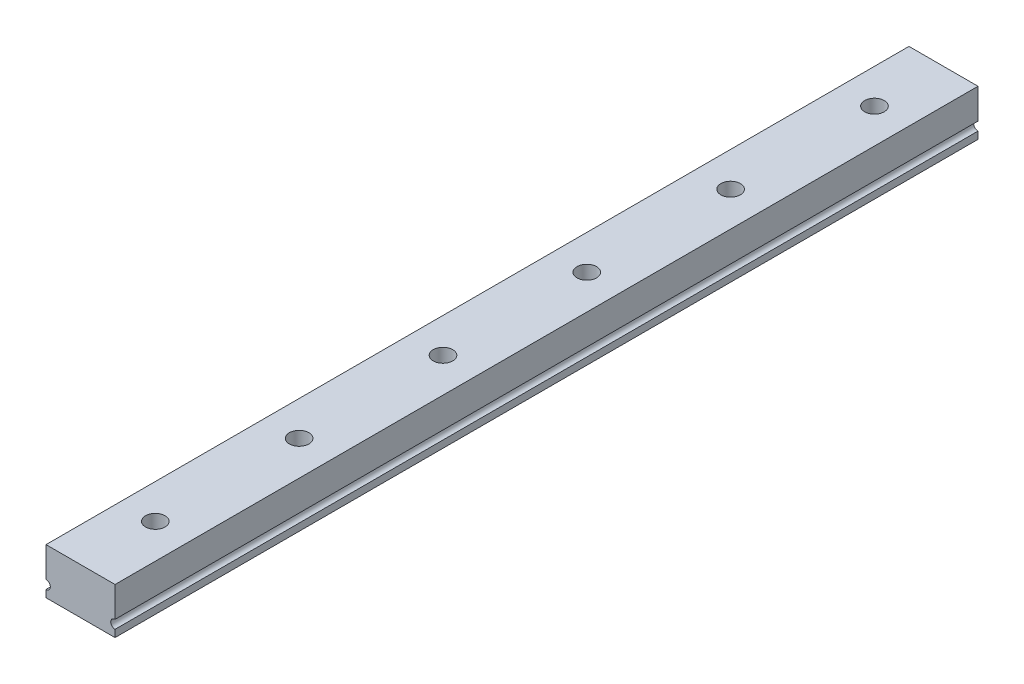
ISO-10303-21;
HEADER;
FILE_DESCRIPTION(('STEP AP214'),'2;1');
FILE_NAME('part.step','',(''),(''),'','','');
FILE_SCHEMA(('AUTOMOTIVE_DESIGN { 1 0 10303 214 1 1 1 1 }'));
ENDSEC;
DATA;
#1=APPLICATION_CONTEXT('core data for automotive mechanical design processes');
#2=APPLICATION_PROTOCOL_DEFINITION('international standard','automotive_design',2000,#1);
#3=PRODUCT_CONTEXT('',#1,'mechanical');
#4=PRODUCT('Part','Part','',(#3));
#5=PRODUCT_RELATED_PRODUCT_CATEGORY('part','',(#4));
#6=PRODUCT_DEFINITION_FORMATION('','',#4);
#7=PRODUCT_DEFINITION_CONTEXT('part definition',#1,'design');
#8=PRODUCT_DEFINITION('design','',#6,#7);
#9=PRODUCT_DEFINITION_SHAPE('','',#8);
#10=(LENGTH_UNIT() NAMED_UNIT(*) SI_UNIT(.MILLI.,.METRE.));
#11=(NAMED_UNIT(*) PLANE_ANGLE_UNIT() SI_UNIT($,.RADIAN.));
#12=(NAMED_UNIT(*) SI_UNIT($,.STERADIAN.) SOLID_ANGLE_UNIT());
#13=UNCERTAINTY_MEASURE_WITH_UNIT(LENGTH_MEASURE(1.E-05),#10,'distance_accuracy_value','');
#14=(GEOMETRIC_REPRESENTATION_CONTEXT(3) GLOBAL_UNCERTAINTY_ASSIGNED_CONTEXT((#13)) GLOBAL_UNIT_ASSIGNED_CONTEXT((#10,
#11,#12)) REPRESENTATION_CONTEXT('',''));
#15=CARTESIAN_POINT('',(0.,0.,0.));
#16=DIRECTION('',(0.,0.,1.));
#17=DIRECTION('',(1.,0.,0.));
#18=AXIS2_PLACEMENT_3D('',#15,#16,#17);
#19=CARTESIAN_POINT('',(0.,-28.,-188.));
#20=DIRECTION('',(0.,-1.,0.));
#21=DIRECTION('',(0.,0.,-1.));
#22=AXIS2_PLACEMENT_3D('',#19,#20,#21);
#23=CYLINDRICAL_SURFACE('',#22,4.6755);
#24=CARTESIAN_POINT('',(0.,-26.,-188.));
#25=DIRECTION('',(0.,-1.,0.));
#26=DIRECTION('',(0.,0.,-1.));
#27=AXIS2_PLACEMENT_3D('',#24,#25,#26);
#28=CIRCLE('',#27,4.6755);
#29=CARTESIAN_POINT('',(0.,-26.,-192.6755));
#30=VERTEX_POINT('',#29);
#31=EDGE_CURVE('E11',#30,#30,#28,.T.);
#32=ORIENTED_EDGE('',*,*,#31,.F.);
#33=EDGE_LOOP('',(#32));
#34=FACE_BOUND('',#33,.T.);
#35=CARTESIAN_POINT('',(0.,-28.,-188.));
#36=DIRECTION('',(0.,-1.,0.));
#37=DIRECTION('',(0.,0.,-1.));
#38=AXIS2_PLACEMENT_3D('',#35,#36,#37);
#39=CIRCLE('',#38,4.6755);
#40=CARTESIAN_POINT('',(0.,-28.,-192.6755));
#41=VERTEX_POINT('',#40);
#42=EDGE_CURVE('E173',#41,#41,#39,.T.);
#43=ORIENTED_EDGE('',*,*,#42,.T.);
#44=EDGE_LOOP('',(#43));
#45=FACE_BOUND('',#44,.T.);
#46=ADVANCED_FACE('F33',(#34,#45),#23,.F.);
#47=CARTESIAN_POINT('',(1.7,-26.,-188.));
#48=DIRECTION('',(0.,1.,0.));
#49=DIRECTION('',(0.,0.,1.));
#50=AXIS2_PLACEMENT_3D('',#47,#48,#49);
#51=PLANE('',#50);
#52=CARTESIAN_POINT('',(0.,-26.,-188.));
#53=DIRECTION('',(0.,-1.,0.));
#54=DIRECTION('',(0.,0.,-1.));
#55=AXIS2_PLACEMENT_3D('',#52,#53,#54);
#56=CIRCLE('',#55,1.7);
#57=CARTESIAN_POINT('',(0.,-26.,-189.7));
#58=VERTEX_POINT('',#57);
#59=EDGE_CURVE('E40',#58,#58,#56,.T.);
#60=ORIENTED_EDGE('',*,*,#59,.F.);
#61=EDGE_LOOP('',(#60));
#62=FACE_BOUND('',#61,.T.);
#63=ORIENTED_EDGE('',*,*,#31,.T.);
#64=EDGE_LOOP('',(#63));
#65=FACE_BOUND('',#64,.T.);
#66=ADVANCED_FACE('F184',(#62,#65),#51,.F.);
#67=CARTESIAN_POINT('',(0.,-28.,-188.));
#68=DIRECTION('',(0.,-1.,0.));
#69=DIRECTION('',(0.,0.,-1.));
#70=AXIS2_PLACEMENT_3D('',#67,#68,#69);
#71=CYLINDRICAL_SURFACE('',#70,1.7);
#72=ORIENTED_EDGE('',*,*,#59,.T.);
#73=EDGE_LOOP('',(#72));
#74=FACE_BOUND('',#73,.T.);
#75=CARTESIAN_POINT('',(0.,-20.,-188.));
#76=DIRECTION('',(0.,1.,0.));
#77=DIRECTION('',(0.,0.,1.));
#78=AXIS2_PLACEMENT_3D('',#75,#76,#77);
#79=CIRCLE('',#78,1.7);
#80=CARTESIAN_POINT('',(0.,-20.,-186.3));
#81=VERTEX_POINT('',#80);
#82=EDGE_CURVE('E176',#81,#81,#79,.T.);
#83=ORIENTED_EDGE('',*,*,#82,.T.);
#84=EDGE_LOOP('',(#83));
#85=FACE_BOUND('',#84,.T.);
#86=ADVANCED_FACE('F181',(#74,#85),#71,.F.);
#87=CARTESIAN_POINT('',(0.,-28.,-163.));
#88=DIRECTION('',(0.,-1.,0.));
#89=DIRECTION('',(0.,0.,-1.));
#90=AXIS2_PLACEMENT_3D('',#87,#88,#89);
#91=CYLINDRICAL_SURFACE('',#90,4.6755);
#92=CARTESIAN_POINT('',(0.,-26.,-163.));
#93=DIRECTION('',(0.,-1.,0.));
#94=DIRECTION('',(0.,0.,-1.));
#95=AXIS2_PLACEMENT_3D('',#92,#93,#94);
#96=CIRCLE('',#95,4.6755);
#97=CARTESIAN_POINT('',(0.,-26.,-167.6755));
#98=VERTEX_POINT('',#97);
#99=EDGE_CURVE('E170',#98,#98,#96,.T.);
#100=ORIENTED_EDGE('',*,*,#99,.F.);
#101=EDGE_LOOP('',(#100));
#102=FACE_BOUND('',#101,.T.);
#103=CARTESIAN_POINT('',(0.,-28.,-163.));
#104=DIRECTION('',(0.,-1.,0.));
#105=DIRECTION('',(0.,0.,-1.));
#106=AXIS2_PLACEMENT_3D('',#103,#104,#105);
#107=CIRCLE('',#106,4.6755);
#108=CARTESIAN_POINT('',(0.,-28.,-167.6755));
#109=VERTEX_POINT('',#108);
#110=EDGE_CURVE('E161',#109,#109,#107,.T.);
#111=ORIENTED_EDGE('',*,*,#110,.T.);
#112=EDGE_LOOP('',(#111));
#113=FACE_BOUND('',#112,.T.);
#114=ADVANCED_FACE('F248',(#102,#113),#91,.F.);
#115=CARTESIAN_POINT('',(1.7,-26.,-163.));
#116=DIRECTION('',(0.,1.,0.));
#117=DIRECTION('',(0.,0.,1.));
#118=AXIS2_PLACEMENT_3D('',#115,#116,#117);
#119=PLANE('',#118);
#120=CARTESIAN_POINT('',(0.,-26.,-163.));
#121=DIRECTION('',(0.,-1.,0.));
#122=DIRECTION('',(0.,0.,-1.));
#123=AXIS2_PLACEMENT_3D('',#120,#121,#122);
#124=CIRCLE('',#123,1.7);
#125=CARTESIAN_POINT('',(0.,-26.,-164.7));
#126=VERTEX_POINT('',#125);
#127=EDGE_CURVE('E167',#126,#126,#124,.T.);
#128=ORIENTED_EDGE('',*,*,#127,.F.);
#129=EDGE_LOOP('',(#128));
#130=FACE_BOUND('',#129,.T.);
#131=ORIENTED_EDGE('',*,*,#99,.T.);
#132=EDGE_LOOP('',(#131));
#133=FACE_BOUND('',#132,.T.);
#134=ADVANCED_FACE('F244',(#130,#133),#119,.F.);
#135=CARTESIAN_POINT('',(0.,-28.,-163.));
#136=DIRECTION('',(0.,-1.,0.));
#137=DIRECTION('',(0.,0.,-1.));
#138=AXIS2_PLACEMENT_3D('',#135,#136,#137);
#139=CYLINDRICAL_SURFACE('',#138,1.7);
#140=ORIENTED_EDGE('',*,*,#127,.T.);
#141=EDGE_LOOP('',(#140));
#142=FACE_BOUND('',#141,.T.);
#143=CARTESIAN_POINT('',(0.,-20.,-163.));
#144=DIRECTION('',(0.,1.,0.));
#145=DIRECTION('',(0.,0.,1.));
#146=AXIS2_PLACEMENT_3D('',#143,#144,#145);
#147=CIRCLE('',#146,1.7);
#148=CARTESIAN_POINT('',(0.,-20.,-161.3));
#149=VERTEX_POINT('',#148);
#150=EDGE_CURVE('E164',#149,#149,#147,.T.);
#151=ORIENTED_EDGE('',*,*,#150,.T.);
#152=EDGE_LOOP('',(#151));
#153=FACE_BOUND('',#152,.T.);
#154=ADVANCED_FACE('F240',(#142,#153),#139,.F.);
#155=CARTESIAN_POINT('',(0.,-28.,-138.));
#156=DIRECTION('',(0.,-1.,0.));
#157=DIRECTION('',(0.,0.,-1.));
#158=AXIS2_PLACEMENT_3D('',#155,#156,#157);
#159=CYLINDRICAL_SURFACE('',#158,4.6755);
#160=CARTESIAN_POINT('',(0.,-26.,-138.));
#161=DIRECTION('',(0.,-1.,0.));
#162=DIRECTION('',(0.,0.,-1.));
#163=AXIS2_PLACEMENT_3D('',#160,#161,#162);
#164=CIRCLE('',#163,4.6755);
#165=CARTESIAN_POINT('',(0.,-26.,-142.6755));
#166=VERTEX_POINT('',#165);
#167=EDGE_CURVE('E158',#166,#166,#164,.T.);
#168=ORIENTED_EDGE('',*,*,#167,.F.);
#169=EDGE_LOOP('',(#168));
#170=FACE_BOUND('',#169,.T.);
#171=CARTESIAN_POINT('',(0.,-28.,-138.));
#172=DIRECTION('',(0.,-1.,0.));
#173=DIRECTION('',(0.,0.,-1.));
#174=AXIS2_PLACEMENT_3D('',#171,#172,#173);
#175=CIRCLE('',#174,4.6755);
#176=CARTESIAN_POINT('',(0.,-28.,-142.6755));
#177=VERTEX_POINT('',#176);
#178=EDGE_CURVE('E149',#177,#177,#175,.T.);
#179=ORIENTED_EDGE('',*,*,#178,.T.);
#180=EDGE_LOOP('',(#179));
#181=FACE_BOUND('',#180,.T.);
#182=ADVANCED_FACE('F236',(#170,#181),#159,.F.);
#183=CARTESIAN_POINT('',(1.7,-26.,-138.));
#184=DIRECTION('',(0.,1.,0.));
#185=DIRECTION('',(0.,0.,1.));
#186=AXIS2_PLACEMENT_3D('',#183,#184,#185);
#187=PLANE('',#186);
#188=CARTESIAN_POINT('',(0.,-26.,-138.));
#189=DIRECTION('',(0.,-1.,0.));
#190=DIRECTION('',(0.,0.,-1.));
#191=AXIS2_PLACEMENT_3D('',#188,#189,#190);
#192=CIRCLE('',#191,1.7);
#193=CARTESIAN_POINT('',(0.,-26.,-139.7));
#194=VERTEX_POINT('',#193);
#195=EDGE_CURVE('E155',#194,#194,#192,.T.);
#196=ORIENTED_EDGE('',*,*,#195,.F.);
#197=EDGE_LOOP('',(#196));
#198=FACE_BOUND('',#197,.T.);
#199=ORIENTED_EDGE('',*,*,#167,.T.);
#200=EDGE_LOOP('',(#199));
#201=FACE_BOUND('',#200,.T.);
#202=ADVANCED_FACE('F232',(#198,#201),#187,.F.);
#203=CARTESIAN_POINT('',(0.,-28.,-138.));
#204=DIRECTION('',(0.,-1.,0.));
#205=DIRECTION('',(0.,0.,-1.));
#206=AXIS2_PLACEMENT_3D('',#203,#204,#205);
#207=CYLINDRICAL_SURFACE('',#206,1.7);
#208=ORIENTED_EDGE('',*,*,#195,.T.);
#209=EDGE_LOOP('',(#208));
#210=FACE_BOUND('',#209,.T.);
#211=CARTESIAN_POINT('',(0.,-20.,-138.));
#212=DIRECTION('',(0.,1.,0.));
#213=DIRECTION('',(0.,0.,1.));
#214=AXIS2_PLACEMENT_3D('',#211,#212,#213);
#215=CIRCLE('',#214,1.7);
#216=CARTESIAN_POINT('',(0.,-20.,-136.3));
#217=VERTEX_POINT('',#216);
#218=EDGE_CURVE('E152',#217,#217,#215,.T.);
#219=ORIENTED_EDGE('',*,*,#218,.T.);
#220=EDGE_LOOP('',(#219));
#221=FACE_BOUND('',#220,.T.);
#222=ADVANCED_FACE('F228',(#210,#221),#207,.F.);
#223=CARTESIAN_POINT('',(0.,-28.,-113.));
#224=DIRECTION('',(0.,-1.,0.));
#225=DIRECTION('',(0.,0.,-1.));
#226=AXIS2_PLACEMENT_3D('',#223,#224,#225);
#227=CYLINDRICAL_SURFACE('',#226,4.6755);
#228=CARTESIAN_POINT('',(0.,-26.,-113.));
#229=DIRECTION('',(0.,-1.,0.));
#230=DIRECTION('',(0.,0.,-1.));
#231=AXIS2_PLACEMENT_3D('',#228,#229,#230);
#232=CIRCLE('',#231,4.6755);
#233=CARTESIAN_POINT('',(0.,-26.,-117.6755));
#234=VERTEX_POINT('',#233);
#235=EDGE_CURVE('E146',#234,#234,#232,.T.);
#236=ORIENTED_EDGE('',*,*,#235,.F.);
#237=EDGE_LOOP('',(#236));
#238=FACE_BOUND('',#237,.T.);
#239=CARTESIAN_POINT('',(0.,-28.,-113.));
#240=DIRECTION('',(0.,-1.,0.));
#241=DIRECTION('',(0.,0.,-1.));
#242=AXIS2_PLACEMENT_3D('',#239,#240,#241);
#243=CIRCLE('',#242,4.6755);
#244=CARTESIAN_POINT('',(0.,-28.,-117.6755));
#245=VERTEX_POINT('',#244);
#246=EDGE_CURVE('E128',#245,#245,#243,.T.);
#247=ORIENTED_EDGE('',*,*,#246,.T.);
#248=EDGE_LOOP('',(#247));
#249=FACE_BOUND('',#248,.T.);
#250=ADVANCED_FACE('F224',(#238,#249),#227,.F.);
#251=CARTESIAN_POINT('',(1.7,-26.,-113.));
#252=DIRECTION('',(0.,1.,0.));
#253=DIRECTION('',(0.,0.,1.));
#254=AXIS2_PLACEMENT_3D('',#251,#252,#253);
#255=PLANE('',#254);
#256=CARTESIAN_POINT('',(0.,-26.,-113.));
#257=DIRECTION('',(0.,-1.,0.));
#258=DIRECTION('',(0.,0.,-1.));
#259=AXIS2_PLACEMENT_3D('',#256,#257,#258);
#260=CIRCLE('',#259,1.7);
#261=CARTESIAN_POINT('',(0.,-26.,-114.7));
#262=VERTEX_POINT('',#261);
#263=EDGE_CURVE('E143',#262,#262,#260,.T.);
#264=ORIENTED_EDGE('',*,*,#263,.F.);
#265=EDGE_LOOP('',(#264));
#266=FACE_BOUND('',#265,.T.);
#267=ORIENTED_EDGE('',*,*,#235,.T.);
#268=EDGE_LOOP('',(#267));
#269=FACE_BOUND('',#268,.T.);
#270=ADVANCED_FACE('F220',(#266,#269),#255,.F.);
#271=CARTESIAN_POINT('',(0.,-28.,-113.));
#272=DIRECTION('',(0.,-1.,0.));
#273=DIRECTION('',(0.,0.,-1.));
#274=AXIS2_PLACEMENT_3D('',#271,#272,#273);
#275=CYLINDRICAL_SURFACE('',#274,1.7);
#276=ORIENTED_EDGE('',*,*,#263,.T.);
#277=EDGE_LOOP('',(#276));
#278=FACE_BOUND('',#277,.T.);
#279=CARTESIAN_POINT('',(0.,-20.,-113.));
#280=DIRECTION('',(0.,1.,0.));
#281=DIRECTION('',(0.,0.,1.));
#282=AXIS2_PLACEMENT_3D('',#279,#280,#281);
#283=CIRCLE('',#282,1.7);
#284=CARTESIAN_POINT('',(0.,-20.,-111.3));
#285=VERTEX_POINT('',#284);
#286=EDGE_CURVE('E140',#285,#285,#283,.T.);
#287=ORIENTED_EDGE('',*,*,#286,.T.);
#288=EDGE_LOOP('',(#287));
#289=FACE_BOUND('',#288,.T.);
#290=ADVANCED_FACE('F217',(#278,#289),#275,.F.);
#291=CARTESIAN_POINT('',(6.,-28.,-200.));
#292=DIRECTION('',(1.,0.,0.));
#293=DIRECTION('',(0.,0.,-1.));
#294=AXIS2_PLACEMENT_3D('',#291,#292,#293);
#295=PLANE('',#294);
#296=DIRECTION('',(0.,0.,1.));
#297=VECTOR('',#296,1.);
#298=CARTESIAN_POINT('',(6.,-25.25,-200.001));
#299=LINE('',#298,#297);
#300=CARTESIAN_POINT('',(6.,-25.25,-50.));
#301=VERTEX_POINT('',#300);
#302=CARTESIAN_POINT('',(6.,-25.25,-200.));
#303=VERTEX_POINT('',#302);
#304=EDGE_CURVE('E55',#301,#303,#299,.F.);
#305=ORIENTED_EDGE('',*,*,#304,.T.);
#306=DIRECTION('',(0.,1.,0.));
#307=VECTOR('',#306,1.);
#308=CARTESIAN_POINT('',(6.,-28.,-200.));
#309=LINE('',#308,#307);
#310=CARTESIAN_POINT('',(6.,-20.,-200.));
#311=VERTEX_POINT('',#310);
#312=EDGE_CURVE('E121',#303,#311,#309,.T.);
#313=ORIENTED_EDGE('',*,*,#312,.T.);
#314=DIRECTION('',(0.,0.,1.));
#315=VECTOR('',#314,1.);
#316=CARTESIAN_POINT('',(6.,-20.,-200.));
#317=LINE('',#316,#315);
#318=CARTESIAN_POINT('',(6.,-20.,-50.));
#319=VERTEX_POINT('',#318);
#320=EDGE_CURVE('E134',#311,#319,#317,.T.);
#321=ORIENTED_EDGE('',*,*,#320,.T.);
#322=DIRECTION('',(0.,1.,0.));
#323=VECTOR('',#322,1.);
#324=CARTESIAN_POINT('',(6.,-28.,-50.));
#325=LINE('',#324,#323);
#326=EDGE_CURVE('E475',#301,#319,#325,.T.);
#327=ORIENTED_EDGE('',*,*,#326,.F.);
#328=EDGE_LOOP('',(#305,#313,#321,#327));
#329=FACE_BOUND('',#328,.T.);
#330=ADVANCED_FACE('F207',(#329),#295,.T.);
#331=CARTESIAN_POINT('',(-6.,-28.,-200.));
#332=DIRECTION('',(-1.,0.,0.));
#333=DIRECTION('',(0.,0.,1.));
#334=AXIS2_PLACEMENT_3D('',#331,#332,#333);
#335=PLANE('',#334);
#336=DIRECTION('',(0.,0.,1.));
#337=VECTOR('',#336,1.);
#338=CARTESIAN_POINT('',(-6.,-26.75,-200.001));
#339=LINE('',#338,#337);
#340=CARTESIAN_POINT('',(-6.,-26.75,-50.));
#341=VERTEX_POINT('',#340);
#342=CARTESIAN_POINT('',(-6.,-26.75,-200.));
#343=VERTEX_POINT('',#342);
#344=EDGE_CURVE('E47',#341,#343,#339,.F.);
#345=ORIENTED_EDGE('',*,*,#344,.T.);
#346=DIRECTION('',(0.,-1.,0.));
#347=VECTOR('',#346,1.);
#348=CARTESIAN_POINT('',(-6.,-28.,-200.));
#349=LINE('',#348,#347);
#350=CARTESIAN_POINT('',(-6.,-28.,-200.));
#351=VERTEX_POINT('',#350);
#352=EDGE_CURVE('E489',#343,#351,#349,.T.);
#353=ORIENTED_EDGE('',*,*,#352,.T.);
#354=DIRECTION('',(0.,0.,1.));
#355=VECTOR('',#354,1.);
#356=CARTESIAN_POINT('',(-6.,-28.,-200.));
#357=LINE('',#356,#355);
#358=CARTESIAN_POINT('',(-6.,-28.,-50.));
#359=VERTEX_POINT('',#358);
#360=EDGE_CURVE('E129',#351,#359,#357,.T.);
#361=ORIENTED_EDGE('',*,*,#360,.T.);
#362=DIRECTION('',(0.,-1.,0.));
#363=VECTOR('',#362,1.);
#364=CARTESIAN_POINT('',(-6.,-28.,-50.));
#365=LINE('',#364,#363);
#366=EDGE_CURVE('E118',#341,#359,#365,.T.);
#367=ORIENTED_EDGE('',*,*,#366,.F.);
#368=EDGE_LOOP('',(#345,#353,#361,#367));
#369=FACE_BOUND('',#368,.T.);
#370=ADVANCED_FACE('F204',(#369),#335,.T.);
#371=DIRECTION('',(0.,0.,1.));
#372=VECTOR('',#371,1.);
#373=CARTESIAN_POINT('',(6.,-26.75,-200.001));
#374=LINE('',#373,#372);
#375=CARTESIAN_POINT('',(6.,-26.75,-200.));
#376=VERTEX_POINT('',#375);
#377=CARTESIAN_POINT('',(6.,-26.75,-50.));
#378=VERTEX_POINT('',#377);
#379=EDGE_CURVE('E471',#376,#378,#374,.T.);
#380=ORIENTED_EDGE('',*,*,#379,.T.);
#381=CARTESIAN_POINT('',(6.,-28.,-50.));
#382=VERTEX_POINT('',#381);
#383=EDGE_CURVE('E492',#382,#378,#325,.T.);
#384=ORIENTED_EDGE('',*,*,#383,.F.);
#385=DIRECTION('',(0.,0.,1.));
#386=VECTOR('',#385,1.);
#387=CARTESIAN_POINT('',(6.,-28.,-200.));
#388=LINE('',#387,#386);
#389=CARTESIAN_POINT('',(6.,-28.,-200.));
#390=VERTEX_POINT('',#389);
#391=EDGE_CURVE('E126',#390,#382,#388,.T.);
#392=ORIENTED_EDGE('',*,*,#391,.F.);
#393=EDGE_CURVE('E483',#390,#376,#309,.T.);
#394=ORIENTED_EDGE('',*,*,#393,.T.);
#395=EDGE_LOOP('',(#380,#384,#392,#394));
#396=FACE_BOUND('',#395,.T.);
#397=ADVANCED_FACE('F195',(#396),#295,.T.);
#398=CARTESIAN_POINT('',(-6.,-28.,-200.));
#399=DIRECTION('',(0.,-1.,0.));
#400=DIRECTION('',(0.,0.,-1.));
#401=AXIS2_PLACEMENT_3D('',#398,#399,#400);
#402=PLANE('',#401);
#403=CARTESIAN_POINT('',(0.,-28.,-88.));
#404=DIRECTION('',(0.,-1.,0.));
#405=DIRECTION('',(0.,0.,-1.));
#406=AXIS2_PLACEMENT_3D('',#403,#404,#405);
#407=CIRCLE('',#406,4.6755);
#408=CARTESIAN_POINT('',(0.,-28.,-92.6755));
#409=VERTEX_POINT('',#408);
#410=EDGE_CURVE('E450',#409,#409,#407,.T.);
#411=ORIENTED_EDGE('',*,*,#410,.F.);
#412=EDGE_LOOP('',(#411));
#413=FACE_BOUND('',#412,.T.);
#414=CARTESIAN_POINT('',(0.,-28.,-63.));
#415=DIRECTION('',(0.,-1.,0.));
#416=DIRECTION('',(0.,0.,-1.));
#417=AXIS2_PLACEMENT_3D('',#414,#415,#416);
#418=CIRCLE('',#417,4.6755);
#419=CARTESIAN_POINT('',(0.,-28.,-67.6755));
#420=VERTEX_POINT('',#419);
#421=EDGE_CURVE('E460',#420,#420,#418,.T.);
#422=ORIENTED_EDGE('',*,*,#421,.F.);
#423=EDGE_LOOP('',(#422));
#424=FACE_BOUND('',#423,.T.);
#425=DIRECTION('',(1.,0.,0.));
#426=VECTOR('',#425,1.);
#427=CARTESIAN_POINT('',(-6.,-28.,-50.));
#428=LINE('',#427,#426);
#429=EDGE_CURVE('E117',#359,#382,#428,.T.);
#430=ORIENTED_EDGE('',*,*,#429,.F.);
#431=ORIENTED_EDGE('',*,*,#360,.F.);
#432=DIRECTION('',(1.,0.,0.));
#433=VECTOR('',#432,1.);
#434=CARTESIAN_POINT('',(-6.,-28.,-200.));
#435=LINE('',#434,#433);
#436=EDGE_CURVE('E137',#351,#390,#435,.T.);
#437=ORIENTED_EDGE('',*,*,#436,.T.);
#438=ORIENTED_EDGE('',*,*,#391,.T.);
#439=EDGE_LOOP('',(#430,#431,#437,#438));
#440=FACE_BOUND('',#439,.T.);
#441=ORIENTED_EDGE('',*,*,#246,.F.);
#442=EDGE_LOOP('',(#441));
#443=FACE_BOUND('',#442,.T.);
#444=ORIENTED_EDGE('',*,*,#178,.F.);
#445=EDGE_LOOP('',(#444));
#446=FACE_BOUND('',#445,.T.);
#447=ORIENTED_EDGE('',*,*,#110,.F.);
#448=EDGE_LOOP('',(#447));
#449=FACE_BOUND('',#448,.T.);
#450=ORIENTED_EDGE('',*,*,#42,.F.);
#451=EDGE_LOOP('',(#450));
#452=FACE_BOUND('',#451,.T.);
#453=ADVANCED_FACE('F193',(#413,#424,#440,#443,#446,#449,#452),#402,.T.);
#454=DIRECTION('',(0.,0.,1.));
#455=VECTOR('',#454,1.);
#456=CARTESIAN_POINT('',(-6.,-25.25,-200.001));
#457=LINE('',#456,#455);
#458=CARTESIAN_POINT('',(-6.,-25.25,-200.));
#459=VERTEX_POINT('',#458);
#460=CARTESIAN_POINT('',(-6.,-25.25,-50.));
#461=VERTEX_POINT('',#460);
#462=EDGE_CURVE('E97',#459,#461,#457,.T.);
#463=ORIENTED_EDGE('',*,*,#462,.T.);
#464=CARTESIAN_POINT('',(-6.,-20.,-50.));
#465=VERTEX_POINT('',#464);
#466=EDGE_CURVE('E108',#465,#461,#365,.T.);
#467=ORIENTED_EDGE('',*,*,#466,.F.);
#468=DIRECTION('',(0.,0.,1.));
#469=VECTOR('',#468,1.);
#470=CARTESIAN_POINT('',(-6.,-20.,-200.));
#471=LINE('',#470,#469);
#472=CARTESIAN_POINT('',(-6.,-20.,-200.));
#473=VERTEX_POINT('',#472);
#474=EDGE_CURVE('E132',#473,#465,#471,.T.);
#475=ORIENTED_EDGE('',*,*,#474,.F.);
#476=EDGE_CURVE('E111',#473,#459,#349,.T.);
#477=ORIENTED_EDGE('',*,*,#476,.T.);
#478=EDGE_LOOP('',(#463,#467,#475,#477));
#479=FACE_BOUND('',#478,.T.);
#480=ADVANCED_FACE('F107',(#479),#335,.T.);
#481=CARTESIAN_POINT('',(-6.,-20.,-200.));
#482=DIRECTION('',(0.,1.,0.));
#483=DIRECTION('',(0.,0.,1.));
#484=AXIS2_PLACEMENT_3D('',#481,#482,#483);
#485=PLANE('',#484);
#486=CARTESIAN_POINT('',(0.,-20.,-88.));
#487=DIRECTION('',(0.,1.,0.));
#488=DIRECTION('',(0.,0.,1.));
#489=AXIS2_PLACEMENT_3D('',#486,#487,#488);
#490=CIRCLE('',#489,1.7);
#491=CARTESIAN_POINT('',(0.,-20.,-86.3));
#492=VERTEX_POINT('',#491);
#493=EDGE_CURVE('E451',#492,#492,#490,.T.);
#494=ORIENTED_EDGE('',*,*,#493,.F.);
#495=EDGE_LOOP('',(#494));
#496=FACE_BOUND('',#495,.T.);
#497=CARTESIAN_POINT('',(0.,-20.,-63.));
#498=DIRECTION('',(0.,1.,0.));
#499=DIRECTION('',(0.,0.,1.));
#500=AXIS2_PLACEMENT_3D('',#497,#498,#499);
#501=CIRCLE('',#500,1.7);
#502=CARTESIAN_POINT('',(0.,-20.,-61.3));
#503=VERTEX_POINT('',#502);
#504=EDGE_CURVE('E469',#503,#503,#501,.T.);
#505=ORIENTED_EDGE('',*,*,#504,.F.);
#506=EDGE_LOOP('',(#505));
#507=FACE_BOUND('',#506,.T.);
#508=DIRECTION('',(-1.,0.,0.));
#509=VECTOR('',#508,1.);
#510=CARTESIAN_POINT('',(-6.,-20.,-50.));
#511=LINE('',#510,#509);
#512=EDGE_CURVE('E116',#319,#465,#511,.T.);
#513=ORIENTED_EDGE('',*,*,#512,.F.);
#514=ORIENTED_EDGE('',*,*,#320,.F.);
#515=DIRECTION('',(-1.,0.,0.));
#516=VECTOR('',#515,1.);
#517=CARTESIAN_POINT('',(-6.,-20.,-200.));
#518=LINE('',#517,#516);
#519=EDGE_CURVE('E486',#311,#473,#518,.T.);
#520=ORIENTED_EDGE('',*,*,#519,.T.);
#521=ORIENTED_EDGE('',*,*,#474,.T.);
#522=EDGE_LOOP('',(#513,#514,#520,#521));
#523=FACE_BOUND('',#522,.T.);
#524=ORIENTED_EDGE('',*,*,#286,.F.);
#525=EDGE_LOOP('',(#524));
#526=FACE_BOUND('',#525,.T.);
#527=ORIENTED_EDGE('',*,*,#218,.F.);
#528=EDGE_LOOP('',(#527));
#529=FACE_BOUND('',#528,.T.);
#530=ORIENTED_EDGE('',*,*,#150,.F.);
#531=EDGE_LOOP('',(#530));
#532=FACE_BOUND('',#531,.T.);
#533=ORIENTED_EDGE('',*,*,#82,.F.);
#534=EDGE_LOOP('',(#533));
#535=FACE_BOUND('',#534,.T.);
#536=ADVANCED_FACE('F202',(#496,#507,#523,#526,#529,#532,#535),#485,.T.);
#537=CARTESIAN_POINT('',(0.,0.,-200.));
#538=DIRECTION('',(0.,0.,-1.));
#539=DIRECTION('',(-1.,0.,0.));
#540=AXIS2_PLACEMENT_3D('',#537,#538,#539);
#541=PLANE('',#540);
#542=CARTESIAN_POINT('',(-6.,-26.,-200.));
#543=DIRECTION('',(0.,0.,-1.));
#544=DIRECTION('',(-1.,0.,0.));
#545=AXIS2_PLACEMENT_3D('',#542,#543,#544);
#546=CIRCLE('',#545,0.75);
#547=EDGE_CURVE('E102',#343,#459,#546,.F.);
#548=ORIENTED_EDGE('',*,*,#547,.T.);
#549=ORIENTED_EDGE('',*,*,#476,.F.);
#550=ORIENTED_EDGE('',*,*,#519,.F.);
#551=ORIENTED_EDGE('',*,*,#312,.F.);
#552=CARTESIAN_POINT('',(6.,-26.,-200.));
#553=DIRECTION('',(0.,0.,-1.));
#554=DIRECTION('',(-1.,0.,0.));
#555=AXIS2_PLACEMENT_3D('',#552,#553,#554);
#556=CIRCLE('',#555,0.75);
#557=EDGE_CURVE('E112',#303,#376,#556,.F.);
#558=ORIENTED_EDGE('',*,*,#557,.T.);
#559=ORIENTED_EDGE('',*,*,#393,.F.);
#560=ORIENTED_EDGE('',*,*,#436,.F.);
#561=ORIENTED_EDGE('',*,*,#352,.F.);
#562=EDGE_LOOP('',(#548,#549,#550,#551,#558,#559,#560,#561));
#563=FACE_BOUND('',#562,.T.);
#564=ADVANCED_FACE('F214',(#563),#541,.T.);
#565=CARTESIAN_POINT('',(0.,0.,-50.));
#566=DIRECTION('',(0.,0.,-1.));
#567=DIRECTION('',(-1.,0.,0.));
#568=AXIS2_PLACEMENT_3D('',#565,#566,#567);
#569=PLANE('',#568);
#570=ORIENTED_EDGE('',*,*,#466,.T.);
#571=CARTESIAN_POINT('',(-6.,-26.,-50.));
#572=DIRECTION('',(0.,0.,1.));
#573=DIRECTION('',(1.,0.,0.));
#574=AXIS2_PLACEMENT_3D('',#571,#572,#573);
#575=CIRCLE('',#574,0.75);
#576=EDGE_CURVE('E94',#341,#461,#575,.T.);
#577=ORIENTED_EDGE('',*,*,#576,.F.);
#578=ORIENTED_EDGE('',*,*,#366,.T.);
#579=ORIENTED_EDGE('',*,*,#429,.T.);
#580=ORIENTED_EDGE('',*,*,#383,.T.);
#581=CARTESIAN_POINT('',(6.,-26.,-50.));
#582=DIRECTION('',(0.,0.,1.));
#583=DIRECTION('',(1.,0.,0.));
#584=AXIS2_PLACEMENT_3D('',#581,#582,#583);
#585=CIRCLE('',#584,0.75);
#586=EDGE_CURVE('E479',#301,#378,#585,.T.);
#587=ORIENTED_EDGE('',*,*,#586,.F.);
#588=ORIENTED_EDGE('',*,*,#326,.T.);
#589=ORIENTED_EDGE('',*,*,#512,.T.);
#590=EDGE_LOOP('',(#570,#577,#578,#579,#580,#587,#588,#589));
#591=FACE_BOUND('',#590,.T.);
#592=ADVANCED_FACE('F114',(#591),#569,.F.);
#593=CARTESIAN_POINT('',(6.,-26.,-200.001));
#594=DIRECTION('',(0.,0.,1.));
#595=DIRECTION('',(1.,0.,0.));
#596=AXIS2_PLACEMENT_3D('',#593,#594,#595);
#597=CYLINDRICAL_SURFACE('',#596,0.75);
#598=ORIENTED_EDGE('',*,*,#586,.T.);
#599=ORIENTED_EDGE('',*,*,#379,.F.);
#600=ORIENTED_EDGE('',*,*,#557,.F.);
#601=ORIENTED_EDGE('',*,*,#304,.F.);
#602=EDGE_LOOP('',(#598,#599,#600,#601));
#603=FACE_BOUND('',#602,.T.);
#604=ADVANCED_FACE('F335',(#603),#597,.F.);
#605=CARTESIAN_POINT('',(-6.,-26.,-200.001));
#606=DIRECTION('',(0.,0.,1.));
#607=DIRECTION('',(1.,0.,0.));
#608=AXIS2_PLACEMENT_3D('',#605,#606,#607);
#609=CYLINDRICAL_SURFACE('',#608,0.75);
#610=ORIENTED_EDGE('',*,*,#576,.T.);
#611=ORIENTED_EDGE('',*,*,#462,.F.);
#612=ORIENTED_EDGE('',*,*,#547,.F.);
#613=ORIENTED_EDGE('',*,*,#344,.F.);
#614=EDGE_LOOP('',(#610,#611,#612,#613));
#615=FACE_BOUND('',#614,.T.);
#616=ADVANCED_FACE('F96',(#615),#609,.F.);
#617=CARTESIAN_POINT('',(0.,-28.,-63.));
#618=DIRECTION('',(0.,-1.,0.));
#619=DIRECTION('',(0.,0.,-1.));
#620=AXIS2_PLACEMENT_3D('',#617,#618,#619);
#621=CYLINDRICAL_SURFACE('',#620,1.7);
#622=CARTESIAN_POINT('',(0.,-26.,-63.));
#623=DIRECTION('',(0.,-1.,0.));
#624=DIRECTION('',(0.,0.,-1.));
#625=AXIS2_PLACEMENT_3D('',#622,#623,#624);
#626=CIRCLE('',#625,1.7);
#627=CARTESIAN_POINT('',(0.,-26.,-64.7));
#628=VERTEX_POINT('',#627);
#629=EDGE_CURVE('E466',#628,#628,#626,.T.);
#630=ORIENTED_EDGE('',*,*,#629,.T.);
#631=EDGE_LOOP('',(#630));
#632=FACE_BOUND('',#631,.T.);
#633=ORIENTED_EDGE('',*,*,#504,.T.);
#634=EDGE_LOOP('',(#633));
#635=FACE_BOUND('',#634,.T.);
#636=ADVANCED_FACE('F351',(#632,#635),#621,.F.);
#637=CARTESIAN_POINT('',(1.7,-26.,-63.));
#638=DIRECTION('',(0.,1.,0.));
#639=DIRECTION('',(0.,0.,1.));
#640=AXIS2_PLACEMENT_3D('',#637,#638,#639);
#641=PLANE('',#640);
#642=ORIENTED_EDGE('',*,*,#629,.F.);
#643=EDGE_LOOP('',(#642));
#644=FACE_BOUND('',#643,.T.);
#645=CARTESIAN_POINT('',(0.,-26.,-63.));
#646=DIRECTION('',(0.,-1.,0.));
#647=DIRECTION('',(0.,0.,-1.));
#648=AXIS2_PLACEMENT_3D('',#645,#646,#647);
#649=CIRCLE('',#648,4.6755);
#650=CARTESIAN_POINT('',(0.,-26.,-67.6755));
#651=VERTEX_POINT('',#650);
#652=EDGE_CURVE('E463',#651,#651,#649,.T.);
#653=ORIENTED_EDGE('',*,*,#652,.T.);
#654=EDGE_LOOP('',(#653));
#655=FACE_BOUND('',#654,.T.);
#656=ADVANCED_FACE('F360',(#644,#655),#641,.F.);
#657=CARTESIAN_POINT('',(0.,-28.,-63.));
#658=DIRECTION('',(0.,-1.,0.));
#659=DIRECTION('',(0.,0.,-1.));
#660=AXIS2_PLACEMENT_3D('',#657,#658,#659);
#661=CYLINDRICAL_SURFACE('',#660,4.6755);
#662=ORIENTED_EDGE('',*,*,#652,.F.);
#663=EDGE_LOOP('',(#662));
#664=FACE_BOUND('',#663,.T.);
#665=ORIENTED_EDGE('',*,*,#421,.T.);
#666=EDGE_LOOP('',(#665));
#667=FACE_BOUND('',#666,.T.);
#668=ADVANCED_FACE('F370',(#664,#667),#661,.F.);
#669=CARTESIAN_POINT('',(0.,-28.,-88.));
#670=DIRECTION('',(0.,-1.,0.));
#671=DIRECTION('',(0.,0.,-1.));
#672=AXIS2_PLACEMENT_3D('',#669,#670,#671);
#673=CYLINDRICAL_SURFACE('',#672,1.7);
#674=CARTESIAN_POINT('',(0.,-26.,-88.));
#675=DIRECTION('',(0.,-1.,0.));
#676=DIRECTION('',(0.,0.,-1.));
#677=AXIS2_PLACEMENT_3D('',#674,#675,#676);
#678=CIRCLE('',#677,1.7);
#679=CARTESIAN_POINT('',(0.,-26.,-89.7));
#680=VERTEX_POINT('',#679);
#681=EDGE_CURVE('E457',#680,#680,#678,.T.);
#682=ORIENTED_EDGE('',*,*,#681,.T.);
#683=EDGE_LOOP('',(#682));
#684=FACE_BOUND('',#683,.T.);
#685=ORIENTED_EDGE('',*,*,#493,.T.);
#686=EDGE_LOOP('',(#685));
#687=FACE_BOUND('',#686,.T.);
#688=ADVANCED_FACE('F380',(#684,#687),#673,.F.);
#689=CARTESIAN_POINT('',(1.7,-26.,-88.));
#690=DIRECTION('',(0.,1.,0.));
#691=DIRECTION('',(0.,0.,1.));
#692=AXIS2_PLACEMENT_3D('',#689,#690,#691);
#693=PLANE('',#692);
#694=ORIENTED_EDGE('',*,*,#681,.F.);
#695=EDGE_LOOP('',(#694));
#696=FACE_BOUND('',#695,.T.);
#697=CARTESIAN_POINT('',(0.,-26.,-88.));
#698=DIRECTION('',(0.,-1.,0.));
#699=DIRECTION('',(0.,0.,-1.));
#700=AXIS2_PLACEMENT_3D('',#697,#698,#699);
#701=CIRCLE('',#700,4.6755);
#702=CARTESIAN_POINT('',(0.,-26.,-92.6755));
#703=VERTEX_POINT('',#702);
#704=EDGE_CURVE('E448',#703,#703,#701,.T.);
#705=ORIENTED_EDGE('',*,*,#704,.T.);
#706=EDGE_LOOP('',(#705));
#707=FACE_BOUND('',#706,.T.);
#708=ADVANCED_FACE('F421',(#696,#707),#693,.F.);
#709=CARTESIAN_POINT('',(0.,-28.,-88.));
#710=DIRECTION('',(0.,-1.,0.));
#711=DIRECTION('',(0.,0.,-1.));
#712=AXIS2_PLACEMENT_3D('',#709,#710,#711);
#713=CYLINDRICAL_SURFACE('',#712,4.6755);
#714=ORIENTED_EDGE('',*,*,#704,.F.);
#715=EDGE_LOOP('',(#714));
#716=FACE_BOUND('',#715,.T.);
#717=ORIENTED_EDGE('',*,*,#410,.T.);
#718=EDGE_LOOP('',(#717));
#719=FACE_BOUND('',#718,.T.);
#720=ADVANCED_FACE('F431',(#716,#719),#713,.F.);
#721=CLOSED_SHELL('',(#46,#66,#86,#114,#134,#154,#182,#202,#222,#250,#270,#290,#330,#370,#397,
#453,#480,#536,#564,#592,#604,#616,#636,#656,#668,#688,#708,#720));
#722=MANIFOLD_SOLID_BREP('B2',#721);
#723=ADVANCED_BREP_SHAPE_REPRESENTATION('',(#18,#722),#14);
#724=SHAPE_DEFINITION_REPRESENTATION(#9,#723);
ENDSEC;
END-ISO-10303-21;
